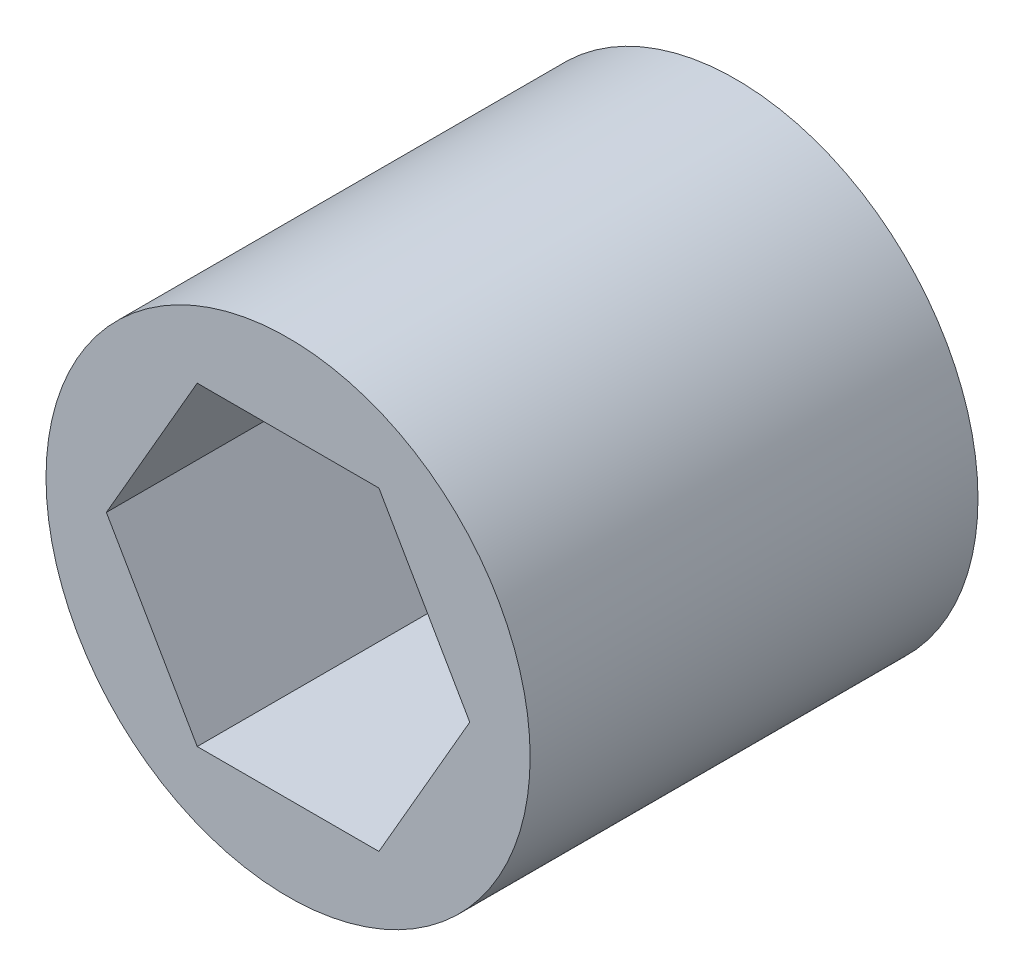
ISO-10303-21;
HEADER;
FILE_DESCRIPTION(('STEP AP214'),'2;1');
FILE_NAME('part.step','',(''),(''),'','','');
FILE_SCHEMA(('AUTOMOTIVE_DESIGN { 1 0 10303 214 1 1 1 1 }'));
ENDSEC;
DATA;
#1=APPLICATION_CONTEXT('core data for automotive mechanical design processes');
#2=APPLICATION_PROTOCOL_DEFINITION('international standard','automotive_design',2000,#1);
#3=PRODUCT_CONTEXT('',#1,'mechanical');
#4=PRODUCT('Part','Part','',(#3));
#5=PRODUCT_RELATED_PRODUCT_CATEGORY('part','',(#4));
#6=PRODUCT_DEFINITION_FORMATION('','',#4);
#7=PRODUCT_DEFINITION_CONTEXT('part definition',#1,'design');
#8=PRODUCT_DEFINITION('design','',#6,#7);
#9=PRODUCT_DEFINITION_SHAPE('','',#8);
#10=(LENGTH_UNIT() NAMED_UNIT(*) SI_UNIT(.MILLI.,.METRE.));
#11=(NAMED_UNIT(*) PLANE_ANGLE_UNIT() SI_UNIT($,.RADIAN.));
#12=(NAMED_UNIT(*) SI_UNIT($,.STERADIAN.) SOLID_ANGLE_UNIT());
#13=UNCERTAINTY_MEASURE_WITH_UNIT(LENGTH_MEASURE(1.E-05),#10,'distance_accuracy_value','');
#14=(GEOMETRIC_REPRESENTATION_CONTEXT(3) GLOBAL_UNCERTAINTY_ASSIGNED_CONTEXT((#13)) GLOBAL_UNIT_ASSIGNED_CONTEXT((#10,
#11,#12)) REPRESENTATION_CONTEXT('',''));
#15=CARTESIAN_POINT('',(0.,0.,0.));
#16=DIRECTION('',(0.,0.,1.));
#17=DIRECTION('',(1.,0.,0.));
#18=AXIS2_PLACEMENT_3D('',#15,#16,#17);
#19=CARTESIAN_POINT('',(0.,0.,1.85));
#20=DIRECTION('',(0.,0.,1.));
#21=DIRECTION('',(1.,0.,0.));
#22=AXIS2_PLACEMENT_3D('',#19,#20,#21);
#23=PLANE('',#22);
#24=CARTESIAN_POINT('',(0.,0.,1.85));
#25=DIRECTION('',(0.,0.,1.));
#26=DIRECTION('',(1.,0.,0.));
#27=AXIS2_PLACEMENT_3D('',#24,#25,#26);
#28=CIRCLE('',#27,2.);
#29=CARTESIAN_POINT('',(2.,0.,1.85));
#30=VERTEX_POINT('',#29);
#31=EDGE_CURVE('E11',#30,#30,#28,.T.);
#32=ORIENTED_EDGE('',*,*,#31,.T.);
#33=EDGE_LOOP('',(#32));
#34=FACE_BOUND('',#33,.T.);
#35=DIRECTION('',(-0.500000000000001,0.866025403784438,0.));
#36=VECTOR('',#35,1.);
#37=CARTESIAN_POINT('',(1.50111069989303,0.,1.85));
#38=LINE('',#37,#36);
#39=CARTESIAN_POINT('',(1.50111069989303,0.,1.85));
#40=VERTEX_POINT('',#39);
#41=CARTESIAN_POINT('',(0.750555349946511,1.3,1.85));
#42=VERTEX_POINT('',#41);
#43=EDGE_CURVE('E102',#40,#42,#38,.T.);
#44=ORIENTED_EDGE('',*,*,#43,.F.);
#45=DIRECTION('',(0.499999999999995,0.866025403784442,0.));
#46=VECTOR('',#45,1.);
#47=CARTESIAN_POINT('',(0.750555349946529,-1.29999999999999,1.85));
#48=LINE('',#47,#46);
#49=CARTESIAN_POINT('',(0.750555349946529,-1.29999999999999,1.85));
#50=VERTEX_POINT('',#49);
#51=EDGE_CURVE('E93',#50,#40,#48,.T.);
#52=ORIENTED_EDGE('',*,*,#51,.F.);
#53=DIRECTION('',(1.,0.,0.));
#54=VECTOR('',#53,1.);
#55=CARTESIAN_POINT('',(-0.750555349946502,-1.30000000000001,1.85));
#56=LINE('',#55,#54);
#57=CARTESIAN_POINT('',(-0.750555349946502,-1.30000000000001,1.85));
#58=VERTEX_POINT('',#57);
#59=EDGE_CURVE('E128',#58,#50,#56,.T.);
#60=ORIENTED_EDGE('',*,*,#59,.F.);
#61=DIRECTION('',(0.500000000000007,-0.866025403784435,0.));
#62=VECTOR('',#61,1.);
#63=CARTESIAN_POINT('',(-1.50111069989303,0.,1.85));
#64=LINE('',#63,#62);
#65=CARTESIAN_POINT('',(-1.50111069989303,0.,1.85));
#66=VERTEX_POINT('',#65);
#67=EDGE_CURVE('E125',#66,#58,#64,.T.);
#68=ORIENTED_EDGE('',*,*,#67,.F.);
#69=DIRECTION('',(-0.499999999999995,-0.866025403784442,0.));
#70=VECTOR('',#69,1.);
#71=CARTESIAN_POINT('',(-0.75055534994652,1.3,1.85));
#72=LINE('',#71,#70);
#73=CARTESIAN_POINT('',(-0.75055534994652,1.3,1.85));
#74=VERTEX_POINT('',#73);
#75=EDGE_CURVE('E121',#74,#66,#72,.T.);
#76=ORIENTED_EDGE('',*,*,#75,.F.);
#77=DIRECTION('',(-1.,0.,0.));
#78=VECTOR('',#77,1.);
#79=CARTESIAN_POINT('',(0.750555349946511,1.3,1.85));
#80=LINE('',#79,#78);
#81=EDGE_CURVE('E115',#42,#74,#80,.T.);
#82=ORIENTED_EDGE('',*,*,#81,.F.);
#83=EDGE_LOOP('',(#44,#52,#60,#68,#76,#82));
#84=FACE_BOUND('',#83,.T.);
#85=ADVANCED_FACE('F39',(#34,#84),#23,.T.);
#86=CARTESIAN_POINT('',(0.,0.,-1.85));
#87=DIRECTION('',(0.,0.,1.));
#88=DIRECTION('',(1.,0.,0.));
#89=AXIS2_PLACEMENT_3D('',#86,#87,#88);
#90=PLANE('',#89);
#91=CARTESIAN_POINT('',(0.,0.,-1.85));
#92=DIRECTION('',(0.,0.,1.));
#93=DIRECTION('',(1.,0.,0.));
#94=AXIS2_PLACEMENT_3D('',#91,#92,#93);
#95=CIRCLE('',#94,2.);
#96=CARTESIAN_POINT('',(2.,0.,-1.85));
#97=VERTEX_POINT('',#96);
#98=EDGE_CURVE('E43',#97,#97,#95,.T.);
#99=ORIENTED_EDGE('',*,*,#98,.F.);
#100=EDGE_LOOP('',(#99));
#101=FACE_BOUND('',#100,.T.);
#102=DIRECTION('',(0.499999999999995,0.866025403784442,0.));
#103=VECTOR('',#102,1.);
#104=CARTESIAN_POINT('',(0.750555349946529,-1.29999999999999,-1.85));
#105=LINE('',#104,#103);
#106=CARTESIAN_POINT('',(0.750555349946529,-1.29999999999999,-1.85));
#107=VERTEX_POINT('',#106);
#108=CARTESIAN_POINT('',(1.50111069989303,0.,-1.85));
#109=VERTEX_POINT('',#108);
#110=EDGE_CURVE('E63',#107,#109,#105,.T.);
#111=ORIENTED_EDGE('',*,*,#110,.T.);
#112=DIRECTION('',(-0.500000000000001,0.866025403784438,0.));
#113=VECTOR('',#112,1.);
#114=CARTESIAN_POINT('',(1.50111069989303,0.,-1.85));
#115=LINE('',#114,#113);
#116=CARTESIAN_POINT('',(0.750555349946511,1.3,-1.85));
#117=VERTEX_POINT('',#116);
#118=EDGE_CURVE('E109',#109,#117,#115,.T.);
#119=ORIENTED_EDGE('',*,*,#118,.T.);
#120=DIRECTION('',(-1.,0.,0.));
#121=VECTOR('',#120,1.);
#122=CARTESIAN_POINT('',(0.750555349946511,1.3,-1.85));
#123=LINE('',#122,#121);
#124=CARTESIAN_POINT('',(-0.75055534994652,1.3,-1.85));
#125=VERTEX_POINT('',#124);
#126=EDGE_CURVE('E135',#117,#125,#123,.T.);
#127=ORIENTED_EDGE('',*,*,#126,.T.);
#128=DIRECTION('',(-0.499999999999995,-0.866025403784442,0.));
#129=VECTOR('',#128,1.);
#130=CARTESIAN_POINT('',(-0.75055534994652,1.3,-1.85));
#131=LINE('',#130,#129);
#132=CARTESIAN_POINT('',(-1.50111069989303,0.,-1.85));
#133=VERTEX_POINT('',#132);
#134=EDGE_CURVE('E139',#125,#133,#131,.T.);
#135=ORIENTED_EDGE('',*,*,#134,.T.);
#136=DIRECTION('',(0.500000000000007,-0.866025403784435,0.));
#137=VECTOR('',#136,1.);
#138=CARTESIAN_POINT('',(-1.50111069989303,0.,-1.85));
#139=LINE('',#138,#137);
#140=CARTESIAN_POINT('',(-0.750555349946502,-1.30000000000001,-1.85));
#141=VERTEX_POINT('',#140);
#142=EDGE_CURVE('E143',#133,#141,#139,.T.);
#143=ORIENTED_EDGE('',*,*,#142,.T.);
#144=DIRECTION('',(1.,0.,0.));
#145=VECTOR('',#144,1.);
#146=CARTESIAN_POINT('',(-0.750555349946502,-1.30000000000001,-1.85));
#147=LINE('',#146,#145);
#148=EDGE_CURVE('E103',#141,#107,#147,.T.);
#149=ORIENTED_EDGE('',*,*,#148,.T.);
#150=EDGE_LOOP('',(#111,#119,#127,#135,#143,#149));
#151=FACE_BOUND('',#150,.T.);
#152=ADVANCED_FACE('F166',(#101,#151),#90,.F.);
#153=CARTESIAN_POINT('',(0.,0.,1.85));
#154=DIRECTION('',(0.,0.,-1.));
#155=DIRECTION('',(-1.,0.,0.));
#156=AXIS2_PLACEMENT_3D('',#153,#154,#155);
#157=CYLINDRICAL_SURFACE('',#156,2.);
#158=ORIENTED_EDGE('',*,*,#31,.F.);
#159=EDGE_LOOP('',(#158));
#160=FACE_BOUND('',#159,.T.);
#161=ORIENTED_EDGE('',*,*,#98,.T.);
#162=EDGE_LOOP('',(#161));
#163=FACE_BOUND('',#162,.T.);
#164=ADVANCED_FACE('F41',(#160,#163),#157,.T.);
#165=CARTESIAN_POINT('',(0.750555349946529,-1.29999999999999,1.85));
#166=DIRECTION('',(-0.866025403784442,0.499999999999995,0.));
#167=DIRECTION('',(-0.499999999999995,-0.866025403784441,0.));
#168=AXIS2_PLACEMENT_3D('',#165,#166,#167);
#169=PLANE('',#168);
#170=ORIENTED_EDGE('',*,*,#110,.F.);
#171=DIRECTION('',(0.,0.,-1.));
#172=VECTOR('',#171,1.);
#173=CARTESIAN_POINT('',(0.750555349946529,-1.29999999999999,1.85));
#174=LINE('',#173,#172);
#175=EDGE_CURVE('E97',#50,#107,#174,.T.);
#176=ORIENTED_EDGE('',*,*,#175,.F.);
#177=ORIENTED_EDGE('',*,*,#51,.T.);
#178=DIRECTION('',(0.,0.,-1.));
#179=VECTOR('',#178,1.);
#180=CARTESIAN_POINT('',(1.50111069989303,0.,1.85));
#181=LINE('',#180,#179);
#182=EDGE_CURVE('E96',#40,#109,#181,.T.);
#183=ORIENTED_EDGE('',*,*,#182,.T.);
#184=EDGE_LOOP('',(#170,#176,#177,#183));
#185=FACE_BOUND('',#184,.T.);
#186=ADVANCED_FACE('F95',(#185),#169,.T.);
#187=CARTESIAN_POINT('',(1.50111069989303,0.,1.85));
#188=DIRECTION('',(-0.866025403784438,-0.500000000000001,0.));
#189=DIRECTION('',(0.500000000000001,-0.866025403784438,0.));
#190=AXIS2_PLACEMENT_3D('',#187,#188,#189);
#191=PLANE('',#190);
#192=ORIENTED_EDGE('',*,*,#118,.F.);
#193=ORIENTED_EDGE('',*,*,#182,.F.);
#194=ORIENTED_EDGE('',*,*,#43,.T.);
#195=DIRECTION('',(0.,0.,-1.));
#196=VECTOR('',#195,1.);
#197=CARTESIAN_POINT('',(0.750555349946511,1.3,1.85));
#198=LINE('',#197,#196);
#199=EDGE_CURVE('E111',#42,#117,#198,.T.);
#200=ORIENTED_EDGE('',*,*,#199,.T.);
#201=EDGE_LOOP('',(#192,#193,#194,#200));
#202=FACE_BOUND('',#201,.T.);
#203=ADVANCED_FACE('F106',(#202),#191,.T.);
#204=CARTESIAN_POINT('',(0.750555349946511,1.3,1.85));
#205=DIRECTION('',(0.,-1.,0.));
#206=DIRECTION('',(1.,0.,0.));
#207=AXIS2_PLACEMENT_3D('',#204,#205,#206);
#208=PLANE('',#207);
#209=ORIENTED_EDGE('',*,*,#126,.F.);
#210=ORIENTED_EDGE('',*,*,#199,.F.);
#211=ORIENTED_EDGE('',*,*,#81,.T.);
#212=DIRECTION('',(0.,0.,-1.));
#213=VECTOR('',#212,1.);
#214=CARTESIAN_POINT('',(-0.75055534994652,1.3,1.85));
#215=LINE('',#214,#213);
#216=EDGE_CURVE('E156',#74,#125,#215,.T.);
#217=ORIENTED_EDGE('',*,*,#216,.T.);
#218=EDGE_LOOP('',(#209,#210,#211,#217));
#219=FACE_BOUND('',#218,.T.);
#220=ADVANCED_FACE('F162',(#219),#208,.T.);
#221=CARTESIAN_POINT('',(-0.75055534994652,1.3,1.85));
#222=DIRECTION('',(0.866025403784442,-0.499999999999995,0.));
#223=DIRECTION('',(0.499999999999995,0.866025403784442,0.));
#224=AXIS2_PLACEMENT_3D('',#221,#222,#223);
#225=PLANE('',#224);
#226=ORIENTED_EDGE('',*,*,#134,.F.);
#227=ORIENTED_EDGE('',*,*,#216,.F.);
#228=ORIENTED_EDGE('',*,*,#75,.T.);
#229=DIRECTION('',(0.,0.,-1.));
#230=VECTOR('',#229,1.);
#231=CARTESIAN_POINT('',(-1.50111069989303,0.,1.85));
#232=LINE('',#231,#230);
#233=EDGE_CURVE('E154',#66,#133,#232,.T.);
#234=ORIENTED_EDGE('',*,*,#233,.T.);
#235=EDGE_LOOP('',(#226,#227,#228,#234));
#236=FACE_BOUND('',#235,.T.);
#237=ADVANCED_FACE('F174',(#236),#225,.T.);
#238=CARTESIAN_POINT('',(-1.50111069989303,0.,1.85));
#239=DIRECTION('',(0.866025403784435,0.500000000000007,0.));
#240=DIRECTION('',(-0.500000000000007,0.866025403784435,0.));
#241=AXIS2_PLACEMENT_3D('',#238,#239,#240);
#242=PLANE('',#241);
#243=ORIENTED_EDGE('',*,*,#142,.F.);
#244=ORIENTED_EDGE('',*,*,#233,.F.);
#245=ORIENTED_EDGE('',*,*,#67,.T.);
#246=DIRECTION('',(0.,0.,-1.));
#247=VECTOR('',#246,1.);
#248=CARTESIAN_POINT('',(-0.750555349946502,-1.30000000000001,1.85));
#249=LINE('',#248,#247);
#250=EDGE_CURVE('E55',#58,#141,#249,.T.);
#251=ORIENTED_EDGE('',*,*,#250,.T.);
#252=EDGE_LOOP('',(#243,#244,#245,#251));
#253=FACE_BOUND('',#252,.T.);
#254=ADVANCED_FACE('F172',(#253),#242,.T.);
#255=CARTESIAN_POINT('',(-0.750555349946502,-1.30000000000001,1.85));
#256=DIRECTION('',(0.,1.,0.));
#257=DIRECTION('',(-1.,0.,0.));
#258=AXIS2_PLACEMENT_3D('',#255,#256,#257);
#259=PLANE('',#258);
#260=ORIENTED_EDGE('',*,*,#148,.F.);
#261=ORIENTED_EDGE('',*,*,#250,.F.);
#262=ORIENTED_EDGE('',*,*,#59,.T.);
#263=ORIENTED_EDGE('',*,*,#175,.T.);
#264=EDGE_LOOP('',(#260,#261,#262,#263));
#265=FACE_BOUND('',#264,.T.);
#266=ADVANCED_FACE('F168',(#265),#259,.T.);
#267=CLOSED_SHELL('',(#85,#152,#164,#186,#203,#220,#237,#254,#266));
#268=MANIFOLD_SOLID_BREP('B2',#267);
#269=ADVANCED_BREP_SHAPE_REPRESENTATION('',(#18,#268),#14);
#270=SHAPE_DEFINITION_REPRESENTATION(#9,#269);
ENDSEC;
END-ISO-10303-21;
